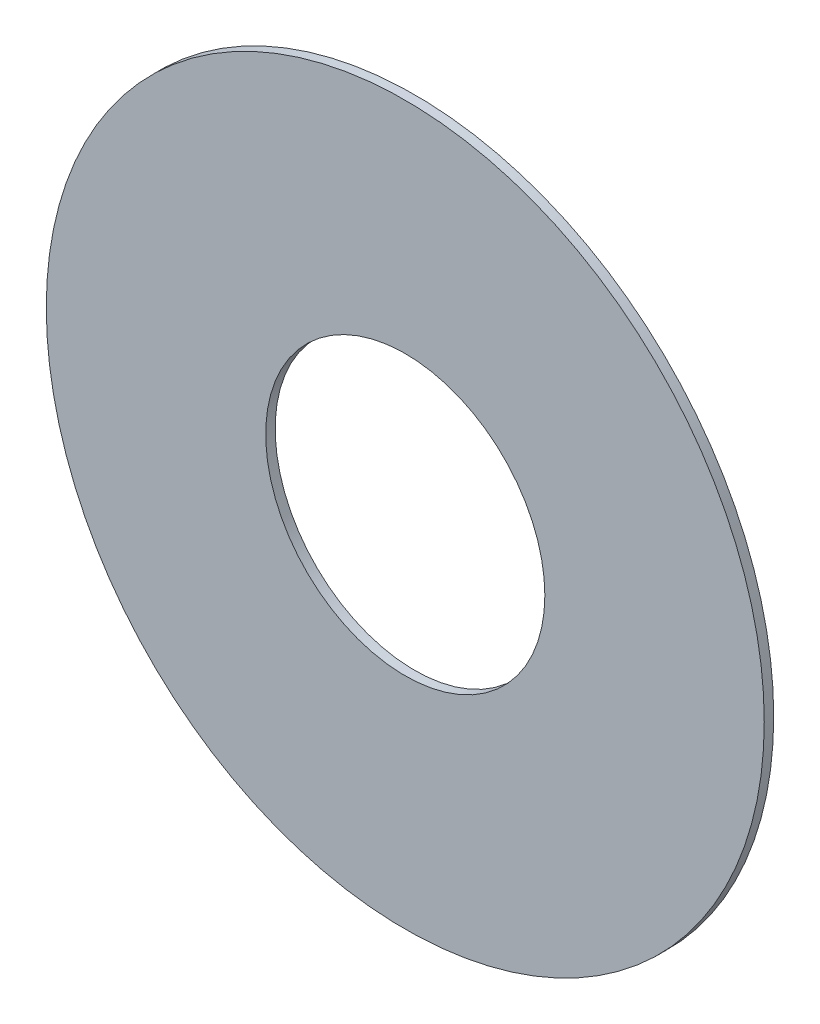
ISO-10303-21;
HEADER;
FILE_DESCRIPTION(('STEP AP214'),'2;1');
FILE_NAME('part.step','',(''),(''),'','','');
FILE_SCHEMA(('AUTOMOTIVE_DESIGN { 1 0 10303 214 1 1 1 1 }'));
ENDSEC;
DATA;
#1=APPLICATION_CONTEXT('core data for automotive mechanical design processes');
#2=APPLICATION_PROTOCOL_DEFINITION('international standard','automotive_design',2000,#1);
#3=PRODUCT_CONTEXT('',#1,'mechanical');
#4=PRODUCT('Part','Part','',(#3));
#5=PRODUCT_RELATED_PRODUCT_CATEGORY('part','',(#4));
#6=PRODUCT_DEFINITION_FORMATION('','',#4);
#7=PRODUCT_DEFINITION_CONTEXT('part definition',#1,'design');
#8=PRODUCT_DEFINITION('design','',#6,#7);
#9=PRODUCT_DEFINITION_SHAPE('','',#8);
#10=(LENGTH_UNIT() NAMED_UNIT(*) SI_UNIT(.MILLI.,.METRE.));
#11=(NAMED_UNIT(*) PLANE_ANGLE_UNIT() SI_UNIT($,.RADIAN.));
#12=(NAMED_UNIT(*) SI_UNIT($,.STERADIAN.) SOLID_ANGLE_UNIT());
#13=UNCERTAINTY_MEASURE_WITH_UNIT(LENGTH_MEASURE(1.E-05),#10,'distance_accuracy_value','');
#14=(GEOMETRIC_REPRESENTATION_CONTEXT(3) GLOBAL_UNCERTAINTY_ASSIGNED_CONTEXT((#13)) GLOBAL_UNIT_ASSIGNED_CONTEXT((#10,
#11,#12)) REPRESENTATION_CONTEXT('',''));
#15=CARTESIAN_POINT('',(0.,0.,0.));
#16=DIRECTION('',(0.,0.,1.));
#17=DIRECTION('',(1.,0.,0.));
#18=AXIS2_PLACEMENT_3D('',#15,#16,#17);
#19=CARTESIAN_POINT('',(0.,0.,42.5));
#20=DIRECTION('',(0.,0.,1.));
#21=DIRECTION('',(1.,0.,0.));
#22=AXIS2_PLACEMENT_3D('',#19,#20,#21);
#23=PLANE('',#22);
#24=CARTESIAN_POINT('',(0.,0.,42.5));
#25=DIRECTION('',(0.,0.,1.));
#26=DIRECTION('',(1.,0.,0.));
#27=AXIS2_PLACEMENT_3D('',#24,#25,#26);
#28=CIRCLE('',#27,75.8769230769231);
#29=CARTESIAN_POINT('',(75.8769230769231,0.,42.5));
#30=VERTEX_POINT('',#29);
#31=EDGE_CURVE('E10',#30,#30,#28,.T.);
#32=ORIENTED_EDGE('',*,*,#31,.T.);
#33=EDGE_LOOP('',(#32));
#34=FACE_BOUND('',#33,.T.);
#35=CARTESIAN_POINT('',(0.,0.,42.5));
#36=DIRECTION('',(0.,0.,1.));
#37=DIRECTION('',(1.,0.,0.));
#38=AXIS2_PLACEMENT_3D('',#35,#36,#37);
#39=CIRCLE('',#38,29.5);
#40=CARTESIAN_POINT('',(29.5,0.,42.5));
#41=VERTEX_POINT('',#40);
#42=EDGE_CURVE('E46',#41,#41,#39,.T.);
#43=ORIENTED_EDGE('',*,*,#42,.F.);
#44=EDGE_LOOP('',(#43));
#45=FACE_BOUND('',#44,.T.);
#46=ADVANCED_FACE('F35',(#34,#45),#23,.T.);
#47=CARTESIAN_POINT('',(0.,0.,40.5));
#48=DIRECTION('',(0.,0.,1.));
#49=DIRECTION('',(1.,0.,0.));
#50=AXIS2_PLACEMENT_3D('',#47,#48,#49);
#51=PLANE('',#50);
#52=CARTESIAN_POINT('',(0.,0.,40.5));
#53=DIRECTION('',(0.,0.,1.));
#54=DIRECTION('',(1.,0.,0.));
#55=AXIS2_PLACEMENT_3D('',#52,#53,#54);
#56=CIRCLE('',#55,75.8769230769231);
#57=CARTESIAN_POINT('',(75.8769230769231,0.,40.5));
#58=VERTEX_POINT('',#57);
#59=EDGE_CURVE('E39',#58,#58,#56,.T.);
#60=ORIENTED_EDGE('',*,*,#59,.F.);
#61=EDGE_LOOP('',(#60));
#62=FACE_BOUND('',#61,.T.);
#63=CARTESIAN_POINT('',(0.,0.,40.5));
#64=DIRECTION('',(0.,0.,1.));
#65=DIRECTION('',(1.,0.,0.));
#66=AXIS2_PLACEMENT_3D('',#63,#64,#65);
#67=CIRCLE('',#66,29.5);
#68=CARTESIAN_POINT('',(29.5,0.,40.5));
#69=VERTEX_POINT('',#68);
#70=EDGE_CURVE('E48',#69,#69,#67,.T.);
#71=ORIENTED_EDGE('',*,*,#70,.T.);
#72=EDGE_LOOP('',(#71));
#73=FACE_BOUND('',#72,.T.);
#74=ADVANCED_FACE('F58',(#62,#73),#51,.F.);
#75=CARTESIAN_POINT('',(0.,0.,42.5));
#76=DIRECTION('',(0.,0.,-1.));
#77=DIRECTION('',(-1.,0.,0.));
#78=AXIS2_PLACEMENT_3D('',#75,#76,#77);
#79=CYLINDRICAL_SURFACE('',#78,75.8769230769231);
#80=ORIENTED_EDGE('',*,*,#31,.F.);
#81=EDGE_LOOP('',(#80));
#82=FACE_BOUND('',#81,.T.);
#83=ORIENTED_EDGE('',*,*,#59,.T.);
#84=EDGE_LOOP('',(#83));
#85=FACE_BOUND('',#84,.T.);
#86=ADVANCED_FACE('F37',(#82,#85),#79,.T.);
#87=CARTESIAN_POINT('',(0.,0.,42.5));
#88=DIRECTION('',(0.,0.,-1.));
#89=DIRECTION('',(-1.,0.,0.));
#90=AXIS2_PLACEMENT_3D('',#87,#88,#89);
#91=CYLINDRICAL_SURFACE('',#90,29.5);
#92=ORIENTED_EDGE('',*,*,#42,.T.);
#93=EDGE_LOOP('',(#92));
#94=FACE_BOUND('',#93,.T.);
#95=ORIENTED_EDGE('',*,*,#70,.F.);
#96=EDGE_LOOP('',(#95));
#97=FACE_BOUND('',#96,.T.);
#98=ADVANCED_FACE('F54',(#94,#97),#91,.F.);
#99=CLOSED_SHELL('',(#46,#74,#86,#98));
#100=MANIFOLD_SOLID_BREP('B2',#99);
#101=ADVANCED_BREP_SHAPE_REPRESENTATION('',(#18,#100),#14);
#102=SHAPE_DEFINITION_REPRESENTATION(#9,#101);
ENDSEC;
END-ISO-10303-21;
